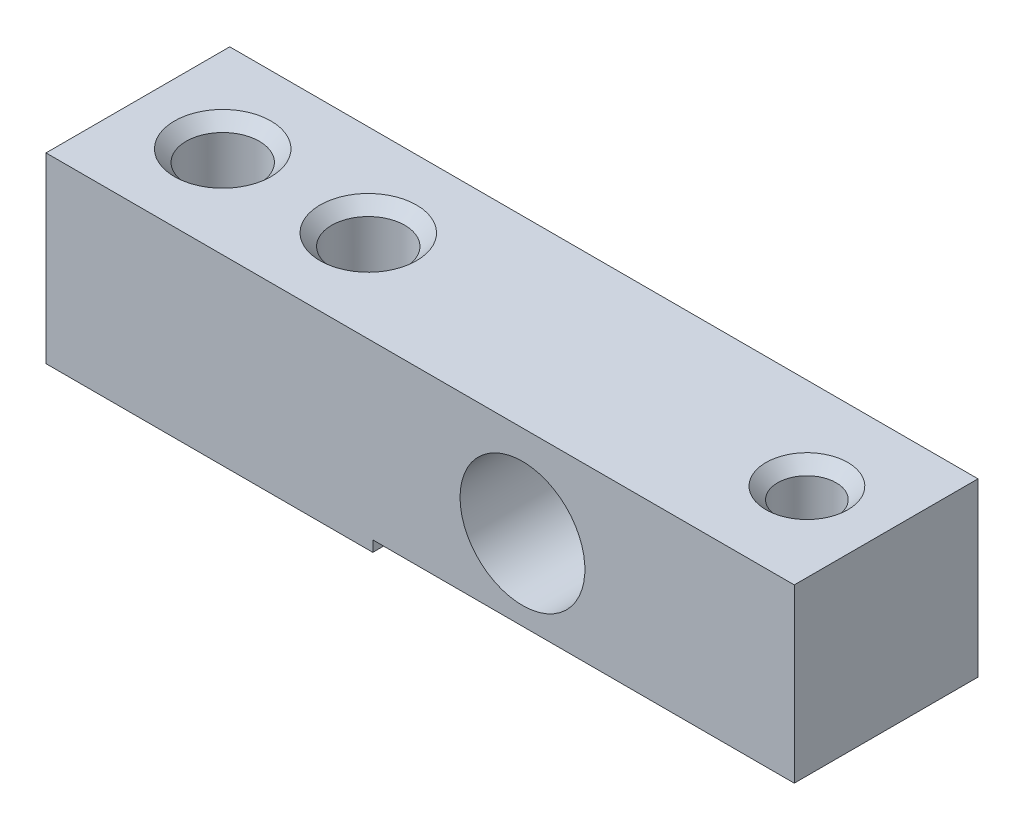
ISO-10303-21;
HEADER;
FILE_DESCRIPTION(('STEP AP214'),'2;1');
FILE_NAME('part.step','',(''),(''),'','','');
FILE_SCHEMA(('AUTOMOTIVE_DESIGN { 1 0 10303 214 1 1 1 1 }'));
ENDSEC;
DATA;
#1=APPLICATION_CONTEXT('core data for automotive mechanical design processes');
#2=APPLICATION_PROTOCOL_DEFINITION('international standard','automotive_design',2000,#1);
#3=PRODUCT_CONTEXT('',#1,'mechanical');
#4=PRODUCT('Part','Part','',(#3));
#5=PRODUCT_RELATED_PRODUCT_CATEGORY('part','',(#4));
#6=PRODUCT_DEFINITION_FORMATION('','',#4);
#7=PRODUCT_DEFINITION_CONTEXT('part definition',#1,'design');
#8=PRODUCT_DEFINITION('design','',#6,#7);
#9=PRODUCT_DEFINITION_SHAPE('','',#8);
#10=(LENGTH_UNIT() NAMED_UNIT(*) SI_UNIT(.MILLI.,.METRE.));
#11=(NAMED_UNIT(*) PLANE_ANGLE_UNIT() SI_UNIT($,.RADIAN.));
#12=(NAMED_UNIT(*) SI_UNIT($,.STERADIAN.) SOLID_ANGLE_UNIT());
#13=UNCERTAINTY_MEASURE_WITH_UNIT(LENGTH_MEASURE(1.E-05),#10,'distance_accuracy_value','');
#14=(GEOMETRIC_REPRESENTATION_CONTEXT(3) GLOBAL_UNCERTAINTY_ASSIGNED_CONTEXT((#13)) GLOBAL_UNIT_ASSIGNED_CONTEXT((#10,
#11,#12)) REPRESENTATION_CONTEXT('',''));
#15=CARTESIAN_POINT('',(0.,0.,0.));
#16=DIRECTION('',(0.,0.,1.));
#17=DIRECTION('',(1.,0.,0.));
#18=AXIS2_PLACEMENT_3D('',#15,#16,#17);
#19=CARTESIAN_POINT('',(129.921,0.,0.));
#20=DIRECTION('',(1.,0.,0.));
#21=DIRECTION('',(0.,0.,-1.));
#22=AXIS2_PLACEMENT_3D('',#19,#20,#21);
#23=PLANE('',#22);
#24=DIRECTION('',(0.,-1.,0.));
#25=VECTOR('',#24,1.);
#26=CARTESIAN_POINT('',(129.921,-15.8496,15.9512));
#27=LINE('',#26,#25);
#28=CARTESIAN_POINT('',(129.921,15.8496,15.9512));
#29=VERTEX_POINT('',#28);
#30=CARTESIAN_POINT('',(129.921,-13.97,15.9512));
#31=VERTEX_POINT('',#30);
#32=EDGE_CURVE('E86',#29,#31,#27,.T.);
#33=ORIENTED_EDGE('',*,*,#32,.T.);
#34=DIRECTION('',(0.,0.,1.));
#35=VECTOR('',#34,1.);
#36=CARTESIAN_POINT('',(129.921,-13.97,-15.9512));
#37=LINE('',#36,#35);
#38=CARTESIAN_POINT('',(129.921,-13.97,-15.9512));
#39=VERTEX_POINT('',#38);
#40=EDGE_CURVE('E203',#39,#31,#37,.T.);
#41=ORIENTED_EDGE('',*,*,#40,.F.);
#42=DIRECTION('',(0.,1.,0.));
#43=VECTOR('',#42,1.);
#44=CARTESIAN_POINT('',(129.921,-15.8496,-15.9512));
#45=LINE('',#44,#43);
#46=CARTESIAN_POINT('',(129.921,15.8496,-15.9512));
#47=VERTEX_POINT('',#46);
#48=EDGE_CURVE('E209',#39,#47,#45,.T.);
#49=ORIENTED_EDGE('',*,*,#48,.T.);
#50=DIRECTION('',(0.,0.,1.));
#51=VECTOR('',#50,1.);
#52=CARTESIAN_POINT('',(129.921,15.8496,-15.9512));
#53=LINE('',#52,#51);
#54=EDGE_CURVE('E57',#47,#29,#53,.T.);
#55=ORIENTED_EDGE('',*,*,#54,.T.);
#56=EDGE_LOOP('',(#33,#41,#49,#55));
#57=FACE_BOUND('',#56,.T.);
#58=ADVANCED_FACE('F33',(#57),#23,.T.);
#59=CARTESIAN_POINT('',(129.921,-15.8496,15.9512));
#60=DIRECTION('',(0.,0.,-1.));
#61=DIRECTION('',(-1.,0.,0.));
#62=AXIS2_PLACEMENT_3D('',#59,#60,#61);
#63=PLANE('',#62);
#64=CARTESIAN_POINT('',(82.7278240955422,0.,15.9512));
#65=DIRECTION('',(0.,0.,-1.));
#66=DIRECTION('',(-1.,0.,0.));
#67=AXIS2_PLACEMENT_3D('',#64,#65,#66);
#68=CIRCLE('',#67,10.8369356073838);
#69=CARTESIAN_POINT('',(71.8908884881584,0.,15.9512));
#70=VERTEX_POINT('',#69);
#71=EDGE_CURVE('E213',#70,#70,#68,.T.);
#72=ORIENTED_EDGE('',*,*,#71,.T.);
#73=EDGE_LOOP('',(#72));
#74=FACE_BOUND('',#73,.T.);
#75=DIRECTION('',(-1.,0.,0.));
#76=VECTOR('',#75,1.);
#77=CARTESIAN_POINT('',(129.921,-15.8496,15.9512));
#78=LINE('',#77,#76);
#79=CARTESIAN_POINT('',(56.7436,-15.8496,15.9512));
#80=VERTEX_POINT('',#79);
#81=CARTESIAN_POINT('',(0.,-15.8496,15.9512));
#82=VERTEX_POINT('',#81);
#83=EDGE_CURVE('E113',#80,#82,#78,.T.);
#84=ORIENTED_EDGE('',*,*,#83,.F.);
#85=DIRECTION('',(0.,-1.,0.));
#86=VECTOR('',#85,1.);
#87=CARTESIAN_POINT('',(56.7436,-13.97,15.9512));
#88=LINE('',#87,#86);
#89=CARTESIAN_POINT('',(56.7436,-13.97,15.9512));
#90=VERTEX_POINT('',#89);
#91=EDGE_CURVE('E104',#90,#80,#88,.T.);
#92=ORIENTED_EDGE('',*,*,#91,.F.);
#93=DIRECTION('',(-1.,0.,0.));
#94=VECTOR('',#93,1.);
#95=CARTESIAN_POINT('',(129.921,-13.97,15.9512));
#96=LINE('',#95,#94);
#97=EDGE_CURVE('E199',#31,#90,#96,.T.);
#98=ORIENTED_EDGE('',*,*,#97,.F.);
#99=ORIENTED_EDGE('',*,*,#32,.F.);
#100=DIRECTION('',(-1.,0.,0.));
#101=VECTOR('',#100,1.);
#102=CARTESIAN_POINT('',(129.921,15.8496,15.9512));
#103=LINE('',#102,#101);
#104=CARTESIAN_POINT('',(0.,15.8496,15.9512));
#105=VERTEX_POINT('',#104);
#106=EDGE_CURVE('E79',#29,#105,#103,.T.);
#107=ORIENTED_EDGE('',*,*,#106,.T.);
#108=DIRECTION('',(0.,-1.,0.));
#109=VECTOR('',#108,1.);
#110=CARTESIAN_POINT('',(0.,-15.8496,15.9512));
#111=LINE('',#110,#109);
#112=EDGE_CURVE('E93',#105,#82,#111,.T.);
#113=ORIENTED_EDGE('',*,*,#112,.T.);
#114=EDGE_LOOP('',(#84,#92,#98,#99,#107,#113));
#115=FACE_BOUND('',#114,.T.);
#116=ADVANCED_FACE('F92',(#74,#115),#63,.F.);
#117=CARTESIAN_POINT('',(129.921,-15.8496,-15.9512));
#118=DIRECTION('',(0.,1.,0.));
#119=DIRECTION('',(0.,0.,1.));
#120=AXIS2_PLACEMENT_3D('',#117,#118,#119);
#121=PLANE('',#120);
#122=CARTESIAN_POINT('',(14.732,-15.8496,0.));
#123=DIRECTION('',(0.,1.,0.));
#124=DIRECTION('',(0.,0.,1.));
#125=AXIS2_PLACEMENT_3D('',#122,#123,#124);
#126=CIRCLE('',#125,6.35);
#127=CARTESIAN_POINT('',(14.732,-15.8496,6.35));
#128=VERTEX_POINT('',#127);
#129=EDGE_CURVE('E178',#128,#128,#126,.T.);
#130=ORIENTED_EDGE('',*,*,#129,.T.);
#131=EDGE_LOOP('',(#130));
#132=FACE_BOUND('',#131,.T.);
#133=CARTESIAN_POINT('',(40.005,-15.8496,0.));
#134=DIRECTION('',(0.,1.,0.));
#135=DIRECTION('',(0.,0.,1.));
#136=AXIS2_PLACEMENT_3D('',#133,#134,#135);
#137=CIRCLE('',#136,6.35);
#138=CARTESIAN_POINT('',(40.005,-15.8496,6.35));
#139=VERTEX_POINT('',#138);
#140=EDGE_CURVE('E120',#139,#139,#137,.T.);
#141=ORIENTED_EDGE('',*,*,#140,.T.);
#142=EDGE_LOOP('',(#141));
#143=FACE_BOUND('',#142,.T.);
#144=DIRECTION('',(-1.,0.,0.));
#145=VECTOR('',#144,1.);
#146=CARTESIAN_POINT('',(129.921,-15.8496,-15.9512));
#147=LINE('',#146,#145);
#148=CARTESIAN_POINT('',(56.7436,-15.8496,-15.9512));
#149=VERTEX_POINT('',#148);
#150=CARTESIAN_POINT('',(0.,-15.8496,-15.9512));
#151=VERTEX_POINT('',#150);
#152=EDGE_CURVE('E111',#149,#151,#147,.T.);
#153=ORIENTED_EDGE('',*,*,#152,.F.);
#154=DIRECTION('',(0.,0.,-1.));
#155=VECTOR('',#154,1.);
#156=CARTESIAN_POINT('',(56.7436,-15.8496,-15.9512));
#157=LINE('',#156,#155);
#158=EDGE_CURVE('E119',#80,#149,#157,.T.);
#159=ORIENTED_EDGE('',*,*,#158,.F.);
#160=ORIENTED_EDGE('',*,*,#83,.T.);
#161=DIRECTION('',(0.,0.,-1.));
#162=VECTOR('',#161,1.);
#163=CARTESIAN_POINT('',(0.,-15.8496,-15.9512));
#164=LINE('',#163,#162);
#165=EDGE_CURVE('E99',#82,#151,#164,.T.);
#166=ORIENTED_EDGE('',*,*,#165,.T.);
#167=EDGE_LOOP('',(#153,#159,#160,#166));
#168=FACE_BOUND('',#167,.T.);
#169=ADVANCED_FACE('F155',(#132,#143,#168),#121,.F.);
#170=CARTESIAN_POINT('',(129.921,-15.8496,-15.9512));
#171=DIRECTION('',(0.,0.,1.));
#172=DIRECTION('',(1.,0.,0.));
#173=AXIS2_PLACEMENT_3D('',#170,#171,#172);
#174=PLANE('',#173);
#175=CARTESIAN_POINT('',(82.7278240955422,0.,-15.9512));
#176=DIRECTION('',(0.,0.,-1.));
#177=DIRECTION('',(-1.,0.,0.));
#178=AXIS2_PLACEMENT_3D('',#175,#176,#177);
#179=CIRCLE('',#178,10.8369356073838);
#180=CARTESIAN_POINT('',(71.8908884881584,0.,-15.9512));
#181=VERTEX_POINT('',#180);
#182=EDGE_CURVE('E214',#181,#181,#179,.T.);
#183=ORIENTED_EDGE('',*,*,#182,.F.);
#184=EDGE_LOOP('',(#183));
#185=FACE_BOUND('',#184,.T.);
#186=DIRECTION('',(1.,0.,0.));
#187=VECTOR('',#186,1.);
#188=CARTESIAN_POINT('',(129.921,-13.97,-15.9512));
#189=LINE('',#188,#187);
#190=CARTESIAN_POINT('',(56.7436,-13.97,-15.9512));
#191=VERTEX_POINT('',#190);
#192=EDGE_CURVE('E48',#191,#39,#189,.T.);
#193=ORIENTED_EDGE('',*,*,#192,.F.);
#194=DIRECTION('',(0.,-1.,0.));
#195=VECTOR('',#194,1.);
#196=CARTESIAN_POINT('',(56.7436,-13.97,-15.9512));
#197=LINE('',#196,#195);
#198=EDGE_CURVE('E100',#191,#149,#197,.T.);
#199=ORIENTED_EDGE('',*,*,#198,.T.);
#200=ORIENTED_EDGE('',*,*,#152,.T.);
#201=DIRECTION('',(0.,1.,0.));
#202=VECTOR('',#201,1.);
#203=CARTESIAN_POINT('',(0.,-15.8496,-15.9512));
#204=LINE('',#203,#202);
#205=CARTESIAN_POINT('',(0.,15.8496,-15.9512));
#206=VERTEX_POINT('',#205);
#207=EDGE_CURVE('E87',#151,#206,#204,.T.);
#208=ORIENTED_EDGE('',*,*,#207,.T.);
#209=DIRECTION('',(-1.,0.,0.));
#210=VECTOR('',#209,1.);
#211=CARTESIAN_POINT('',(129.921,15.8496,-15.9512));
#212=LINE('',#211,#210);
#213=EDGE_CURVE('E82',#47,#206,#212,.T.);
#214=ORIENTED_EDGE('',*,*,#213,.F.);
#215=ORIENTED_EDGE('',*,*,#48,.F.);
#216=EDGE_LOOP('',(#193,#199,#200,#208,#214,#215));
#217=FACE_BOUND('',#216,.T.);
#218=ADVANCED_FACE('F166',(#185,#217),#174,.F.);
#219=CARTESIAN_POINT('',(129.921,15.8496,-15.9512));
#220=DIRECTION('',(0.,-1.,0.));
#221=DIRECTION('',(0.,0.,-1.));
#222=AXIS2_PLACEMENT_3D('',#219,#220,#221);
#223=PLANE('',#222);
#224=CARTESIAN_POINT('',(116.1669,15.8496,0.));
#225=DIRECTION('',(0.,-1.,0.));
#226=DIRECTION('',(0.,0.,-1.));
#227=AXIS2_PLACEMENT_3D('',#224,#225,#226);
#228=CIRCLE('',#227,7.11200000000005);
#229=CARTESIAN_POINT('',(116.1669,15.8496,-7.11200000000005));
#230=VERTEX_POINT('',#229);
#231=EDGE_CURVE('E129',#230,#230,#228,.T.);
#232=ORIENTED_EDGE('',*,*,#231,.T.);
#233=EDGE_LOOP('',(#232));
#234=FACE_BOUND('',#233,.T.);
#235=CARTESIAN_POINT('',(14.732,15.8496,0.));
#236=DIRECTION('',(0.,-1.,0.));
#237=DIRECTION('',(0.,0.,-1.));
#238=AXIS2_PLACEMENT_3D('',#235,#236,#237);
#239=CIRCLE('',#238,8.38200000000006);
#240=CARTESIAN_POINT('',(14.732,15.8496,-8.38200000000006));
#241=VERTEX_POINT('',#240);
#242=EDGE_CURVE('E126',#241,#241,#239,.T.);
#243=ORIENTED_EDGE('',*,*,#242,.T.);
#244=EDGE_LOOP('',(#243));
#245=FACE_BOUND('',#244,.T.);
#246=CARTESIAN_POINT('',(40.005,15.8496,0.));
#247=DIRECTION('',(0.,-1.,0.));
#248=DIRECTION('',(0.,0.,-1.));
#249=AXIS2_PLACEMENT_3D('',#246,#247,#248);
#250=CIRCLE('',#249,8.38200000000006);
#251=CARTESIAN_POINT('',(40.005,15.8496,-8.38200000000006));
#252=VERTEX_POINT('',#251);
#253=EDGE_CURVE('E123',#252,#252,#250,.T.);
#254=ORIENTED_EDGE('',*,*,#253,.T.);
#255=EDGE_LOOP('',(#254));
#256=FACE_BOUND('',#255,.T.);
#257=DIRECTION('',(0.,0.,1.));
#258=VECTOR('',#257,1.);
#259=CARTESIAN_POINT('',(0.,15.8496,-15.9512));
#260=LINE('',#259,#258);
#261=EDGE_CURVE('E76',#206,#105,#260,.T.);
#262=ORIENTED_EDGE('',*,*,#261,.T.);
#263=ORIENTED_EDGE('',*,*,#106,.F.);
#264=ORIENTED_EDGE('',*,*,#54,.F.);
#265=ORIENTED_EDGE('',*,*,#213,.T.);
#266=EDGE_LOOP('',(#262,#263,#264,#265));
#267=FACE_BOUND('',#266,.T.);
#268=ADVANCED_FACE('F78',(#234,#245,#256,#267),#223,.F.);
#269=CARTESIAN_POINT('',(0.,0.,0.));
#270=DIRECTION('',(1.,0.,0.));
#271=DIRECTION('',(0.,0.,-1.));
#272=AXIS2_PLACEMENT_3D('',#269,#270,#271);
#273=PLANE('',#272);
#274=ORIENTED_EDGE('',*,*,#112,.F.);
#275=ORIENTED_EDGE('',*,*,#261,.F.);
#276=ORIENTED_EDGE('',*,*,#207,.F.);
#277=ORIENTED_EDGE('',*,*,#165,.F.);
#278=EDGE_LOOP('',(#274,#275,#276,#277));
#279=FACE_BOUND('',#278,.T.);
#280=ADVANCED_FACE('F97',(#279),#273,.F.);
#281=CARTESIAN_POINT('',(56.7436,-13.97,-15.9512));
#282=DIRECTION('',(-1.,0.,0.));
#283=DIRECTION('',(0.,0.,1.));
#284=AXIS2_PLACEMENT_3D('',#281,#282,#283);
#285=PLANE('',#284);
#286=ORIENTED_EDGE('',*,*,#158,.T.);
#287=ORIENTED_EDGE('',*,*,#198,.F.);
#288=DIRECTION('',(0.,0.,-1.));
#289=VECTOR('',#288,1.);
#290=CARTESIAN_POINT('',(56.7436,-13.97,-15.9512));
#291=LINE('',#290,#289);
#292=EDGE_CURVE('E195',#90,#191,#291,.T.);
#293=ORIENTED_EDGE('',*,*,#292,.F.);
#294=ORIENTED_EDGE('',*,*,#91,.T.);
#295=EDGE_LOOP('',(#286,#287,#293,#294));
#296=FACE_BOUND('',#295,.T.);
#297=ADVANCED_FACE('F160',(#296),#285,.F.);
#298=CARTESIAN_POINT('',(0.,-13.97,0.));
#299=DIRECTION('',(0.,-1.,0.));
#300=DIRECTION('',(0.,0.,-1.));
#301=AXIS2_PLACEMENT_3D('',#298,#299,#300);
#302=PLANE('',#301);
#303=CARTESIAN_POINT('',(116.1669,-13.97,0.));
#304=DIRECTION('',(0.,-1.,0.));
#305=DIRECTION('',(0.,0.,-1.));
#306=AXIS2_PLACEMENT_3D('',#303,#304,#305);
#307=CIRCLE('',#306,5.08);
#308=CARTESIAN_POINT('',(116.1669,-13.97,-5.08));
#309=VERTEX_POINT('',#308);
#310=EDGE_CURVE('E116',#309,#309,#307,.T.);
#311=ORIENTED_EDGE('',*,*,#310,.F.);
#312=EDGE_LOOP('',(#311));
#313=FACE_BOUND('',#312,.T.);
#314=ORIENTED_EDGE('',*,*,#40,.T.);
#315=ORIENTED_EDGE('',*,*,#97,.T.);
#316=ORIENTED_EDGE('',*,*,#292,.T.);
#317=ORIENTED_EDGE('',*,*,#192,.T.);
#318=EDGE_LOOP('',(#314,#315,#316,#317));
#319=FACE_BOUND('',#318,.T.);
#320=ADVANCED_FACE('F198',(#313,#319),#302,.T.);
#321=CARTESIAN_POINT('',(116.1669,-15.8496,0.));
#322=DIRECTION('',(0.,1.,0.));
#323=DIRECTION('',(0.,0.,1.));
#324=AXIS2_PLACEMENT_3D('',#321,#322,#323);
#325=CYLINDRICAL_SURFACE('',#324,5.08);
#326=CARTESIAN_POINT('',(116.1669,13.8176,0.));
#327=DIRECTION('',(0.,-1.,0.));
#328=DIRECTION('',(0.,0.,-1.));
#329=AXIS2_PLACEMENT_3D('',#326,#327,#328);
#330=CIRCLE('',#329,5.08);
#331=CARTESIAN_POINT('',(116.1669,13.8176,-5.08));
#332=VERTEX_POINT('',#331);
#333=EDGE_CURVE('E115',#332,#332,#330,.F.);
#334=ORIENTED_EDGE('',*,*,#333,.T.);
#335=EDGE_LOOP('',(#334));
#336=FACE_BOUND('',#335,.T.);
#337=ORIENTED_EDGE('',*,*,#310,.T.);
#338=EDGE_LOOP('',(#337));
#339=FACE_BOUND('',#338,.T.);
#340=ADVANCED_FACE('F230',(#336,#339),#325,.F.);
#341=CARTESIAN_POINT('',(40.005,-15.8496,0.));
#342=DIRECTION('',(0.,1.,0.));
#343=DIRECTION('',(0.,0.,1.));
#344=AXIS2_PLACEMENT_3D('',#341,#342,#343);
#345=CYLINDRICAL_SURFACE('',#344,6.35);
#346=CARTESIAN_POINT('',(40.005,13.8176,0.));
#347=DIRECTION('',(0.,-1.,0.));
#348=DIRECTION('',(0.,0.,-1.));
#349=AXIS2_PLACEMENT_3D('',#346,#347,#348);
#350=CIRCLE('',#349,6.35);
#351=CARTESIAN_POINT('',(40.005,13.8176,-6.35));
#352=VERTEX_POINT('',#351);
#353=EDGE_CURVE('E11',#352,#352,#350,.F.);
#354=ORIENTED_EDGE('',*,*,#353,.T.);
#355=EDGE_LOOP('',(#354));
#356=FACE_BOUND('',#355,.T.);
#357=ORIENTED_EDGE('',*,*,#140,.F.);
#358=EDGE_LOOP('',(#357));
#359=FACE_BOUND('',#358,.T.);
#360=ADVANCED_FACE('F229',(#356,#359),#345,.F.);
#361=CARTESIAN_POINT('',(14.732,-15.8496,0.));
#362=DIRECTION('',(0.,1.,0.));
#363=DIRECTION('',(0.,0.,1.));
#364=AXIS2_PLACEMENT_3D('',#361,#362,#363);
#365=CYLINDRICAL_SURFACE('',#364,6.35);
#366=CARTESIAN_POINT('',(14.732,13.8176,0.));
#367=DIRECTION('',(0.,-1.,0.));
#368=DIRECTION('',(0.,0.,-1.));
#369=AXIS2_PLACEMENT_3D('',#366,#367,#368);
#370=CIRCLE('',#369,6.35);
#371=CARTESIAN_POINT('',(14.732,13.8176,-6.35));
#372=VERTEX_POINT('',#371);
#373=EDGE_CURVE('E41',#372,#372,#370,.F.);
#374=ORIENTED_EDGE('',*,*,#373,.T.);
#375=EDGE_LOOP('',(#374));
#376=FACE_BOUND('',#375,.T.);
#377=ORIENTED_EDGE('',*,*,#129,.F.);
#378=EDGE_LOOP('',(#377));
#379=FACE_BOUND('',#378,.T.);
#380=ADVANCED_FACE('F134',(#376,#379),#365,.F.);
#381=CARTESIAN_POINT('',(116.1669,13.8176,0.));
#382=DIRECTION('',(0.,1.,0.));
#383=DIRECTION('',(0.,0.,1.));
#384=AXIS2_PLACEMENT_3D('',#381,#382,#383);
#385=CONICAL_SURFACE('',#384,5.08,0.785398163397451);
#386=ORIENTED_EDGE('',*,*,#231,.F.);
#387=EDGE_LOOP('',(#386));
#388=FACE_BOUND('',#387,.T.);
#389=ORIENTED_EDGE('',*,*,#333,.F.);
#390=EDGE_LOOP('',(#389));
#391=FACE_BOUND('',#390,.T.);
#392=ADVANCED_FACE('F139',(#388,#391),#385,.F.);
#393=CARTESIAN_POINT('',(14.732,13.8176,0.));
#394=DIRECTION('',(0.,1.,0.));
#395=DIRECTION('',(0.,0.,1.));
#396=AXIS2_PLACEMENT_3D('',#393,#394,#395);
#397=CONICAL_SURFACE('',#396,6.35,0.785398163397453);
#398=ORIENTED_EDGE('',*,*,#242,.F.);
#399=EDGE_LOOP('',(#398));
#400=FACE_BOUND('',#399,.T.);
#401=ORIENTED_EDGE('',*,*,#373,.F.);
#402=EDGE_LOOP('',(#401));
#403=FACE_BOUND('',#402,.T.);
#404=ADVANCED_FACE('F137',(#400,#403),#397,.F.);
#405=CARTESIAN_POINT('',(40.005,13.8176,0.));
#406=DIRECTION('',(0.,1.,0.));
#407=DIRECTION('',(0.,0.,1.));
#408=AXIS2_PLACEMENT_3D('',#405,#406,#407);
#409=CONICAL_SURFACE('',#408,6.35,0.785398163397453);
#410=ORIENTED_EDGE('',*,*,#253,.F.);
#411=EDGE_LOOP('',(#410));
#412=FACE_BOUND('',#411,.T.);
#413=ORIENTED_EDGE('',*,*,#353,.F.);
#414=EDGE_LOOP('',(#413));
#415=FACE_BOUND('',#414,.T.);
#416=ADVANCED_FACE('F35',(#412,#415),#409,.F.);
#417=CARTESIAN_POINT('',(82.7278240955422,0.,15.9512));
#418=DIRECTION('',(0.,0.,-1.));
#419=DIRECTION('',(-1.,0.,0.));
#420=AXIS2_PLACEMENT_3D('',#417,#418,#419);
#421=CYLINDRICAL_SURFACE('',#420,10.8369356073838);
#422=ORIENTED_EDGE('',*,*,#71,.F.);
#423=EDGE_LOOP('',(#422));
#424=FACE_BOUND('',#423,.T.);
#425=ORIENTED_EDGE('',*,*,#182,.T.);
#426=EDGE_LOOP('',(#425));
#427=FACE_BOUND('',#426,.T.);
#428=ADVANCED_FACE('F145',(#424,#427),#421,.F.);
#429=CLOSED_SHELL('',(#58,#116,#169,#218,#268,#280,#297,#320,#340,#360,#380,#392,#404,#416,#428));
#430=MANIFOLD_SOLID_BREP('B2',#429);
#431=ADVANCED_BREP_SHAPE_REPRESENTATION('',(#18,#430),#14);
#432=SHAPE_DEFINITION_REPRESENTATION(#9,#431);
ENDSEC;
END-ISO-10303-21;
